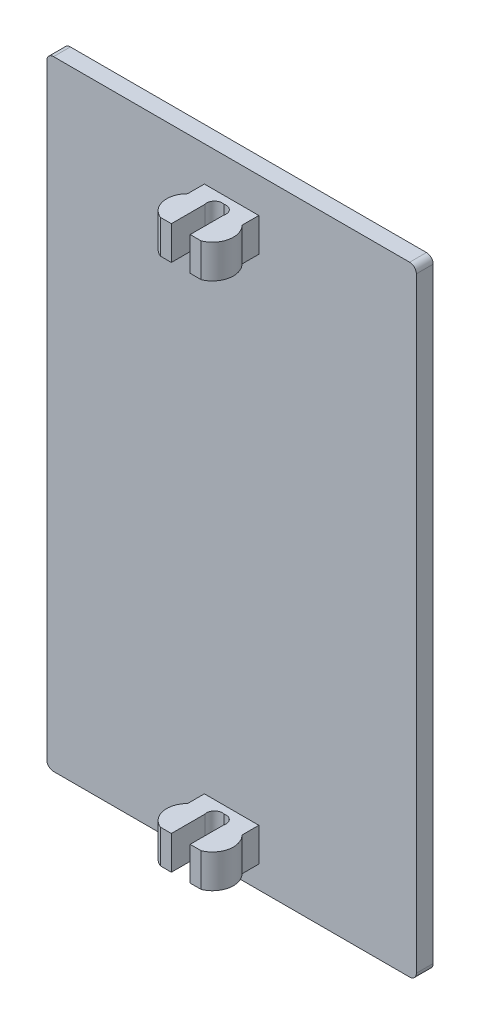
ISO-10303-21;
HEADER;
FILE_DESCRIPTION(('STEP AP214'),'2;1');
FILE_NAME('part.step','',(''),(''),'','','');
FILE_SCHEMA(('AUTOMOTIVE_DESIGN { 1 0 10303 214 1 1 1 1 }'));
ENDSEC;
DATA;
#1=APPLICATION_CONTEXT('core data for automotive mechanical design processes');
#2=APPLICATION_PROTOCOL_DEFINITION('international standard','automotive_design',2000,#1);
#3=PRODUCT_CONTEXT('',#1,'mechanical');
#4=PRODUCT('Part','Part','',(#3));
#5=PRODUCT_RELATED_PRODUCT_CATEGORY('part','',(#4));
#6=PRODUCT_DEFINITION_FORMATION('','',#4);
#7=PRODUCT_DEFINITION_CONTEXT('part definition',#1,'design');
#8=PRODUCT_DEFINITION('design','',#6,#7);
#9=PRODUCT_DEFINITION_SHAPE('','',#8);
#10=(LENGTH_UNIT() NAMED_UNIT(*) SI_UNIT(.MILLI.,.METRE.));
#11=(NAMED_UNIT(*) PLANE_ANGLE_UNIT() SI_UNIT($,.RADIAN.));
#12=(NAMED_UNIT(*) SI_UNIT($,.STERADIAN.) SOLID_ANGLE_UNIT());
#13=UNCERTAINTY_MEASURE_WITH_UNIT(LENGTH_MEASURE(1.E-05),#10,'distance_accuracy_value','');
#14=(GEOMETRIC_REPRESENTATION_CONTEXT(3) GLOBAL_UNCERTAINTY_ASSIGNED_CONTEXT((#13)) GLOBAL_UNIT_ASSIGNED_CONTEXT((#10,
#11,#12)) REPRESENTATION_CONTEXT('',''));
#15=CARTESIAN_POINT('',(0.,0.,0.));
#16=DIRECTION('',(0.,0.,1.));
#17=DIRECTION('',(1.,0.,0.));
#18=AXIS2_PLACEMENT_3D('',#15,#16,#17);
#19=CARTESIAN_POINT('',(-27.5,46.07194529,2.5));
#20=DIRECTION('',(1.,0.,0.));
#21=DIRECTION('',(0.,0.,-1.));
#22=AXIS2_PLACEMENT_3D('',#19,#20,#21);
#23=PLANE('',#22);
#24=DIRECTION('',(0.,-1.,0.));
#25=VECTOR('',#24,1.);
#26=CARTESIAN_POINT('',(-27.5,46.07194529,2.5));
#27=LINE('',#26,#25);
#28=CARTESIAN_POINT('',(-27.5,45.07194529,2.5));
#29=VERTEX_POINT('',#28);
#30=CARTESIAN_POINT('',(-27.5,-45.07194529,2.5));
#31=VERTEX_POINT('',#30);
#32=EDGE_CURVE('E341',#29,#31,#27,.T.);
#33=ORIENTED_EDGE('',*,*,#32,.F.);
#34=DIRECTION('',(0.,0.,-1.));
#35=VECTOR('',#34,1.);
#36=CARTESIAN_POINT('',(-27.5,45.07194529,2.5));
#37=LINE('',#36,#35);
#38=CARTESIAN_POINT('',(-27.5,45.07194529,0.));
#39=VERTEX_POINT('',#38);
#40=EDGE_CURVE('E388',#29,#39,#37,.T.);
#41=ORIENTED_EDGE('',*,*,#40,.T.);
#42=DIRECTION('',(0.,-1.,0.));
#43=VECTOR('',#42,1.);
#44=CARTESIAN_POINT('',(-27.5,46.07194529,0.));
#45=LINE('',#44,#43);
#46=CARTESIAN_POINT('',(-27.5,-45.07194529,0.));
#47=VERTEX_POINT('',#46);
#48=EDGE_CURVE('E340',#39,#47,#45,.T.);
#49=ORIENTED_EDGE('',*,*,#48,.T.);
#50=DIRECTION('',(0.,0.,-1.));
#51=VECTOR('',#50,1.);
#52=CARTESIAN_POINT('',(-27.5,-45.07194529,2.5));
#53=LINE('',#52,#51);
#54=EDGE_CURVE('E386',#47,#31,#53,.F.);
#55=ORIENTED_EDGE('',*,*,#54,.T.);
#56=EDGE_LOOP('',(#33,#41,#49,#55));
#57=FACE_BOUND('',#56,.T.);
#58=ADVANCED_FACE('F33',(#57),#23,.F.);
#59=CARTESIAN_POINT('',(-27.5,-46.07194529,2.5));
#60=DIRECTION('',(0.,1.,0.));
#61=DIRECTION('',(0.,0.,1.));
#62=AXIS2_PLACEMENT_3D('',#59,#60,#61);
#63=PLANE('',#62);
#64=DIRECTION('',(1.,0.,0.));
#65=VECTOR('',#64,1.);
#66=CARTESIAN_POINT('',(-27.5,-46.07194529,0.));
#67=LINE('',#66,#65);
#68=CARTESIAN_POINT('',(-26.5,-46.07194529,0.));
#69=VERTEX_POINT('',#68);
#70=CARTESIAN_POINT('',(26.5,-46.07194529,0.));
#71=VERTEX_POINT('',#70);
#72=EDGE_CURVE('E355',#69,#71,#67,.T.);
#73=ORIENTED_EDGE('',*,*,#72,.T.);
#74=DIRECTION('',(0.,0.,-1.));
#75=VECTOR('',#74,1.);
#76=CARTESIAN_POINT('',(26.5,-46.07194529,2.5));
#77=LINE('',#76,#75);
#78=CARTESIAN_POINT('',(26.5,-46.07194529,2.5));
#79=VERTEX_POINT('',#78);
#80=EDGE_CURVE('E11',#71,#79,#77,.F.);
#81=ORIENTED_EDGE('',*,*,#80,.T.);
#82=DIRECTION('',(1.,0.,0.));
#83=VECTOR('',#82,1.);
#84=CARTESIAN_POINT('',(-27.5,-46.07194529,2.5));
#85=LINE('',#84,#83);
#86=CARTESIAN_POINT('',(-26.5,-46.07194529,2.5));
#87=VERTEX_POINT('',#86);
#88=EDGE_CURVE('E343',#87,#79,#85,.T.);
#89=ORIENTED_EDGE('',*,*,#88,.F.);
#90=DIRECTION('',(0.,0.,-1.));
#91=VECTOR('',#90,1.);
#92=CARTESIAN_POINT('',(-26.5,-46.07194529,2.5));
#93=LINE('',#92,#91);
#94=EDGE_CURVE('E41',#87,#69,#93,.T.);
#95=ORIENTED_EDGE('',*,*,#94,.T.);
#96=EDGE_LOOP('',(#73,#81,#89,#95));
#97=FACE_BOUND('',#96,.T.);
#98=ADVANCED_FACE('F393',(#97),#63,.F.);
#99=CARTESIAN_POINT('',(27.5,46.07194529,2.5));
#100=DIRECTION('',(-1.,0.,0.));
#101=DIRECTION('',(0.,-1.,0.));
#102=AXIS2_PLACEMENT_3D('',#99,#100,#101);
#103=PLANE('',#102);
#104=DIRECTION('',(0.,1.,0.));
#105=VECTOR('',#104,1.);
#106=CARTESIAN_POINT('',(27.5,46.07194529,0.));
#107=LINE('',#106,#105);
#108=CARTESIAN_POINT('',(27.5,-45.07194529,0.));
#109=VERTEX_POINT('',#108);
#110=CARTESIAN_POINT('',(27.5,45.07194529,0.));
#111=VERTEX_POINT('',#110);
#112=EDGE_CURVE('E357',#109,#111,#107,.T.);
#113=ORIENTED_EDGE('',*,*,#112,.T.);
#114=DIRECTION('',(0.,0.,-1.));
#115=VECTOR('',#114,1.);
#116=CARTESIAN_POINT('',(27.5,45.07194529,2.5));
#117=LINE('',#116,#115);
#118=CARTESIAN_POINT('',(27.5,45.07194529,2.5));
#119=VERTEX_POINT('',#118);
#120=EDGE_CURVE('E377',#111,#119,#117,.F.);
#121=ORIENTED_EDGE('',*,*,#120,.T.);
#122=DIRECTION('',(0.,1.,0.));
#123=VECTOR('',#122,1.);
#124=CARTESIAN_POINT('',(27.5,46.07194529,2.5));
#125=LINE('',#124,#123);
#126=CARTESIAN_POINT('',(27.5,-45.07194529,2.5));
#127=VERTEX_POINT('',#126);
#128=EDGE_CURVE('E346',#127,#119,#125,.T.);
#129=ORIENTED_EDGE('',*,*,#128,.F.);
#130=DIRECTION('',(0.,0.,-1.));
#131=VECTOR('',#130,1.);
#132=CARTESIAN_POINT('',(27.5,-45.07194529,2.5));
#133=LINE('',#132,#131);
#134=EDGE_CURVE('E374',#127,#109,#133,.T.);
#135=ORIENTED_EDGE('',*,*,#134,.T.);
#136=EDGE_LOOP('',(#113,#121,#129,#135));
#137=FACE_BOUND('',#136,.T.);
#138=ADVANCED_FACE('F406',(#137),#103,.F.);
#139=CARTESIAN_POINT('',(-27.5,46.07194529,2.5));
#140=DIRECTION('',(0.,-1.,0.));
#141=DIRECTION('',(0.,0.,-1.));
#142=AXIS2_PLACEMENT_3D('',#139,#140,#141);
#143=PLANE('',#142);
#144=DIRECTION('',(-1.,0.,0.));
#145=VECTOR('',#144,1.);
#146=CARTESIAN_POINT('',(-27.5,46.07194529,2.5));
#147=LINE('',#146,#145);
#148=CARTESIAN_POINT('',(26.5,46.07194529,2.5));
#149=VERTEX_POINT('',#148);
#150=CARTESIAN_POINT('',(-26.5,46.07194529,2.5));
#151=VERTEX_POINT('',#150);
#152=EDGE_CURVE('E349',#149,#151,#147,.T.);
#153=ORIENTED_EDGE('',*,*,#152,.F.);
#154=DIRECTION('',(0.,0.,-1.));
#155=VECTOR('',#154,1.);
#156=CARTESIAN_POINT('',(26.5,46.07194529,2.5));
#157=LINE('',#156,#155);
#158=CARTESIAN_POINT('',(26.5,46.07194529,0.));
#159=VERTEX_POINT('',#158);
#160=EDGE_CURVE('E363',#149,#159,#157,.T.);
#161=ORIENTED_EDGE('',*,*,#160,.T.);
#162=DIRECTION('',(-1.,0.,0.));
#163=VECTOR('',#162,1.);
#164=CARTESIAN_POINT('',(-27.5,46.07194529,0.));
#165=LINE('',#164,#163);
#166=CARTESIAN_POINT('',(-26.5,46.07194529,0.));
#167=VERTEX_POINT('',#166);
#168=EDGE_CURVE('E344',#159,#167,#165,.T.);
#169=ORIENTED_EDGE('',*,*,#168,.T.);
#170=DIRECTION('',(0.,0.,-1.));
#171=VECTOR('',#170,1.);
#172=CARTESIAN_POINT('',(-26.5,46.07194529,2.5));
#173=LINE('',#172,#171);
#174=EDGE_CURVE('E352',#167,#151,#173,.F.);
#175=ORIENTED_EDGE('',*,*,#174,.T.);
#176=EDGE_LOOP('',(#153,#161,#169,#175));
#177=FACE_BOUND('',#176,.T.);
#178=ADVANCED_FACE('F415',(#177),#143,.F.);
#179=CARTESIAN_POINT('',(0.,0.,2.5));
#180=DIRECTION('',(0.,0.,1.));
#181=DIRECTION('',(1.,0.,0.));
#182=AXIS2_PLACEMENT_3D('',#179,#180,#181);
#183=PLANE('',#182);
#184=DIRECTION('',(1.,0.,0.));
#185=VECTOR('',#184,1.);
#186=CARTESIAN_POINT('',(4.0530338572275,-42.72805471,2.5));
#187=LINE('',#186,#185);
#188=CARTESIAN_POINT('',(-4.0530338572275,-42.72805471,2.5));
#189=VERTEX_POINT('',#188);
#190=CARTESIAN_POINT('',(4.0530338572275,-42.72805471,2.5));
#191=VERTEX_POINT('',#190);
#192=EDGE_CURVE('E741',#189,#191,#187,.T.);
#193=ORIENTED_EDGE('',*,*,#192,.F.);
#194=DIRECTION('',(0.,1.,0.));
#195=VECTOR('',#194,1.);
#196=CARTESIAN_POINT('',(-4.0530338572275,-42.72805471,2.5));
#197=LINE('',#196,#195);
#198=CARTESIAN_POINT('',(-4.0530338572275,-37.72805471,2.5));
#199=VERTEX_POINT('',#198);
#200=EDGE_CURVE('E774',#189,#199,#197,.T.);
#201=ORIENTED_EDGE('',*,*,#200,.T.);
#202=DIRECTION('',(1.,0.,0.));
#203=VECTOR('',#202,1.);
#204=CARTESIAN_POINT('',(4.0530338572275,-37.72805471,2.5));
#205=LINE('',#204,#203);
#206=CARTESIAN_POINT('',(4.0530338572275,-37.72805471,2.5));
#207=VERTEX_POINT('',#206);
#208=EDGE_CURVE('E803',#199,#207,#205,.T.);
#209=ORIENTED_EDGE('',*,*,#208,.T.);
#210=DIRECTION('',(0.,1.,0.));
#211=VECTOR('',#210,1.);
#212=CARTESIAN_POINT('',(4.0530338572275,-42.72805471,2.5));
#213=LINE('',#212,#211);
#214=EDGE_CURVE('E776',#191,#207,#213,.T.);
#215=ORIENTED_EDGE('',*,*,#214,.F.);
#216=EDGE_LOOP('',(#193,#201,#209,#215));
#217=FACE_BOUND('',#216,.T.);
#218=DIRECTION('',(-1.,0.,0.));
#219=VECTOR('',#218,1.);
#220=CARTESIAN_POINT('',(-4.0530338572275,40.87194529,2.50000000000001));
#221=LINE('',#220,#219);
#222=CARTESIAN_POINT('',(4.0530338572275,40.87194529,2.5));
#223=VERTEX_POINT('',#222);
#224=CARTESIAN_POINT('',(-4.0530338572275,40.87194529,2.50000000000001));
#225=VERTEX_POINT('',#224);
#226=EDGE_CURVE('E276',#223,#225,#221,.T.);
#227=ORIENTED_EDGE('',*,*,#226,.F.);
#228=DIRECTION('',(0.,-1.,0.));
#229=VECTOR('',#228,1.);
#230=CARTESIAN_POINT('',(4.0530338572275,40.87194529,2.5));
#231=LINE('',#230,#229);
#232=CARTESIAN_POINT('',(4.0530338572275,35.87194529,2.5));
#233=VERTEX_POINT('',#232);
#234=EDGE_CURVE('E325',#223,#233,#231,.T.);
#235=ORIENTED_EDGE('',*,*,#234,.T.);
#236=DIRECTION('',(-1.,0.,0.));
#237=VECTOR('',#236,1.);
#238=CARTESIAN_POINT('',(-4.0530338572275,35.87194529,2.50000000000001));
#239=LINE('',#238,#237);
#240=CARTESIAN_POINT('',(-4.0530338572275,35.87194529,2.5));
#241=VERTEX_POINT('',#240);
#242=EDGE_CURVE('E296',#233,#241,#239,.T.);
#243=ORIENTED_EDGE('',*,*,#242,.T.);
#244=DIRECTION('',(0.,-1.,0.));
#245=VECTOR('',#244,1.);
#246=CARTESIAN_POINT('',(-4.0530338572275,40.87194529,2.50000000000001));
#247=LINE('',#246,#245);
#248=EDGE_CURVE('E322',#225,#241,#247,.T.);
#249=ORIENTED_EDGE('',*,*,#248,.F.);
#250=EDGE_LOOP('',(#227,#235,#243,#249));
#251=FACE_BOUND('',#250,.T.);
#252=ORIENTED_EDGE('',*,*,#128,.T.);
#253=CARTESIAN_POINT('',(26.5,45.07194529,2.5));
#254=DIRECTION('',(0.,0.,1.));
#255=DIRECTION('',(1.,0.,0.));
#256=AXIS2_PLACEMENT_3D('',#253,#254,#255);
#257=CIRCLE('',#256,1.);
#258=EDGE_CURVE('E384',#119,#149,#257,.T.);
#259=ORIENTED_EDGE('',*,*,#258,.T.);
#260=ORIENTED_EDGE('',*,*,#152,.T.);
#261=CARTESIAN_POINT('',(-26.5,45.07194529,2.5));
#262=DIRECTION('',(0.,0.,1.));
#263=DIRECTION('',(1.,0.,0.));
#264=AXIS2_PLACEMENT_3D('',#261,#262,#263);
#265=CIRCLE('',#264,1.);
#266=EDGE_CURVE('E382',#151,#29,#265,.T.);
#267=ORIENTED_EDGE('',*,*,#266,.T.);
#268=ORIENTED_EDGE('',*,*,#32,.T.);
#269=CARTESIAN_POINT('',(-26.5,-45.07194529,2.5));
#270=DIRECTION('',(0.,0.,1.));
#271=DIRECTION('',(1.,0.,0.));
#272=AXIS2_PLACEMENT_3D('',#269,#270,#271);
#273=CIRCLE('',#272,1.);
#274=EDGE_CURVE('E53',#31,#87,#273,.T.);
#275=ORIENTED_EDGE('',*,*,#274,.T.);
#276=ORIENTED_EDGE('',*,*,#88,.T.);
#277=CARTESIAN_POINT('',(26.5,-45.07194529,2.5));
#278=DIRECTION('',(0.,0.,1.));
#279=DIRECTION('',(1.,0.,0.));
#280=AXIS2_PLACEMENT_3D('',#277,#278,#279);
#281=CIRCLE('',#280,1.);
#282=EDGE_CURVE('E380',#79,#127,#281,.T.);
#283=ORIENTED_EDGE('',*,*,#282,.T.);
#284=EDGE_LOOP('',(#252,#259,#260,#267,#268,#275,#276,#283));
#285=FACE_BOUND('',#284,.T.);
#286=ADVANCED_FACE('F409',(#217,#251,#285),#183,.T.);
#287=CARTESIAN_POINT('',(0.,0.,0.));
#288=DIRECTION('',(0.,0.,1.));
#289=DIRECTION('',(1.,0.,0.));
#290=AXIS2_PLACEMENT_3D('',#287,#288,#289);
#291=PLANE('',#290);
#292=ORIENTED_EDGE('',*,*,#168,.F.);
#293=CARTESIAN_POINT('',(26.5,45.07194529,0.));
#294=DIRECTION('',(0.,0.,1.));
#295=DIRECTION('',(1.,0.,0.));
#296=AXIS2_PLACEMENT_3D('',#293,#294,#295);
#297=CIRCLE('',#296,1.);
#298=EDGE_CURVE('E372',#159,#111,#297,.F.);
#299=ORIENTED_EDGE('',*,*,#298,.T.);
#300=ORIENTED_EDGE('',*,*,#112,.F.);
#301=CARTESIAN_POINT('',(26.5,-45.07194529,0.));
#302=DIRECTION('',(0.,0.,1.));
#303=DIRECTION('',(1.,0.,0.));
#304=AXIS2_PLACEMENT_3D('',#301,#302,#303);
#305=CIRCLE('',#304,1.);
#306=EDGE_CURVE('E368',#109,#71,#305,.F.);
#307=ORIENTED_EDGE('',*,*,#306,.T.);
#308=ORIENTED_EDGE('',*,*,#72,.F.);
#309=CARTESIAN_POINT('',(-26.5,-45.07194529,0.));
#310=DIRECTION('',(0.,0.,1.));
#311=DIRECTION('',(1.,0.,0.));
#312=AXIS2_PLACEMENT_3D('',#309,#310,#311);
#313=CIRCLE('',#312,1.);
#314=EDGE_CURVE('E366',#69,#47,#313,.F.);
#315=ORIENTED_EDGE('',*,*,#314,.T.);
#316=ORIENTED_EDGE('',*,*,#48,.F.);
#317=CARTESIAN_POINT('',(-26.5,45.07194529,0.));
#318=DIRECTION('',(0.,0.,1.));
#319=DIRECTION('',(1.,0.,0.));
#320=AXIS2_PLACEMENT_3D('',#317,#318,#319);
#321=CIRCLE('',#320,1.);
#322=EDGE_CURVE('E370',#39,#167,#321,.F.);
#323=ORIENTED_EDGE('',*,*,#322,.T.);
#324=EDGE_LOOP('',(#292,#299,#300,#307,#308,#315,#316,#323));
#325=FACE_BOUND('',#324,.T.);
#326=ADVANCED_FACE('F397',(#325),#291,.F.);
#327=CARTESIAN_POINT('',(0.289020958101441,40.87194529,4.75858231023207));
#328=DIRECTION('',(0.,-1.,0.));
#329=DIRECTION('',(0.,0.,-1.));
#330=AXIS2_PLACEMENT_3D('',#327,#328,#329);
#331=CYLINDRICAL_SURFACE('',#330,1.15295111849489);
#332=CARTESIAN_POINT('',(0.289020958101441,35.87194529,4.75858231023207));
#333=DIRECTION('',(0.,-1.,0.));
#334=DIRECTION('',(0.,0.,1.));
#335=AXIS2_PLACEMENT_3D('',#332,#333,#334);
#336=CIRCLE('',#335,1.15295111849489);
#337=CARTESIAN_POINT('',(0.,35.87194529,3.64244469890596));
#338=VERTEX_POINT('',#337);
#339=CARTESIAN_POINT('',(1.4,35.87194529,5.06683845388661));
#340=VERTEX_POINT('',#339);
#341=EDGE_CURVE('E255',#338,#340,#336,.T.);
#342=ORIENTED_EDGE('',*,*,#341,.T.);
#343=DIRECTION('',(0.,-1.,0.));
#344=VECTOR('',#343,1.);
#345=CARTESIAN_POINT('',(1.4,40.87194529,5.06683845388661));
#346=LINE('',#345,#344);
#347=CARTESIAN_POINT('',(1.4,40.87194529,5.06683845388661));
#348=VERTEX_POINT('',#347);
#349=EDGE_CURVE('E337',#348,#340,#346,.T.);
#350=ORIENTED_EDGE('',*,*,#349,.F.);
#351=CARTESIAN_POINT('',(0.289020958101441,40.87194529,4.75858231023207));
#352=DIRECTION('',(0.,-1.,0.));
#353=DIRECTION('',(0.,0.,1.));
#354=AXIS2_PLACEMENT_3D('',#351,#352,#353);
#355=CIRCLE('',#354,1.15295111849489);
#356=CARTESIAN_POINT('',(0.,40.87194529,3.64244469890596));
#357=VERTEX_POINT('',#356);
#358=EDGE_CURVE('E264',#357,#348,#355,.T.);
#359=ORIENTED_EDGE('',*,*,#358,.F.);
#360=DIRECTION('',(0.,-1.,0.));
#361=VECTOR('',#360,1.);
#362=CARTESIAN_POINT('',(0.,40.87194529,3.64244469890596));
#363=LINE('',#362,#361);
#364=EDGE_CURVE('E287',#357,#338,#363,.T.);
#365=ORIENTED_EDGE('',*,*,#364,.T.);
#366=EDGE_LOOP('',(#342,#350,#359,#365));
#367=FACE_BOUND('',#366,.T.);
#368=ADVANCED_FACE('F661',(#367),#331,.F.);
#369=CARTESIAN_POINT('',(1.4,40.87194529,10.0668384538866));
#370=DIRECTION('',(1.,0.,0.));
#371=DIRECTION('',(0.,0.,-1.));
#372=AXIS2_PLACEMENT_3D('',#369,#370,#371);
#373=PLANE('',#372);
#374=DIRECTION('',(0.,0.,1.));
#375=VECTOR('',#374,1.);
#376=CARTESIAN_POINT('',(1.4,35.87194529,10.0668384538866));
#377=LINE('',#376,#375);
#378=CARTESIAN_POINT('',(1.4,35.87194529,10.0668384538866));
#379=VERTEX_POINT('',#378);
#380=EDGE_CURVE('E258',#340,#379,#377,.T.);
#381=ORIENTED_EDGE('',*,*,#380,.T.);
#382=DIRECTION('',(0.,-1.,0.));
#383=VECTOR('',#382,1.);
#384=CARTESIAN_POINT('',(1.4,40.87194529,10.0668384538866));
#385=LINE('',#384,#383);
#386=CARTESIAN_POINT('',(1.4,40.87194529,10.0668384538866));
#387=VERTEX_POINT('',#386);
#388=EDGE_CURVE('E334',#387,#379,#385,.T.);
#389=ORIENTED_EDGE('',*,*,#388,.F.);
#390=DIRECTION('',(0.,0.,1.));
#391=VECTOR('',#390,1.);
#392=CARTESIAN_POINT('',(1.4,40.87194529,10.0668384538866));
#393=LINE('',#392,#391);
#394=EDGE_CURVE('E267',#348,#387,#393,.T.);
#395=ORIENTED_EDGE('',*,*,#394,.F.);
#396=ORIENTED_EDGE('',*,*,#349,.T.);
#397=EDGE_LOOP('',(#381,#389,#395,#396));
#398=FACE_BOUND('',#397,.T.);
#399=ADVANCED_FACE('F652',(#398),#373,.F.);
#400=CARTESIAN_POINT('',(3.03612301673039,40.87194529,10.0668384538866));
#401=DIRECTION('',(0.,0.,-1.));
#402=DIRECTION('',(-1.,0.,0.));
#403=AXIS2_PLACEMENT_3D('',#400,#401,#402);
#404=PLANE('',#403);
#405=DIRECTION('',(1.,0.,0.));
#406=VECTOR('',#405,1.);
#407=CARTESIAN_POINT('',(3.03612301673039,35.87194529,10.0668384538866));
#408=LINE('',#407,#406);
#409=CARTESIAN_POINT('',(3.03612301673039,35.87194529,10.0668384538866));
#410=VERTEX_POINT('',#409);
#411=EDGE_CURVE('E290',#379,#410,#408,.T.);
#412=ORIENTED_EDGE('',*,*,#411,.T.);
#413=DIRECTION('',(0.,-1.,0.));
#414=VECTOR('',#413,1.);
#415=CARTESIAN_POINT('',(3.03612301673039,40.87194529,10.0668384538866));
#416=LINE('',#415,#414);
#417=CARTESIAN_POINT('',(3.03612301673039,40.87194529,10.0668384538866));
#418=VERTEX_POINT('',#417);
#419=EDGE_CURVE('E331',#418,#410,#416,.T.);
#420=ORIENTED_EDGE('',*,*,#419,.F.);
#421=DIRECTION('',(1.,0.,0.));
#422=VECTOR('',#421,1.);
#423=CARTESIAN_POINT('',(3.03612301673039,40.87194529,10.0668384538866));
#424=LINE('',#423,#422);
#425=EDGE_CURVE('E270',#387,#418,#424,.T.);
#426=ORIENTED_EDGE('',*,*,#425,.F.);
#427=ORIENTED_EDGE('',*,*,#388,.T.);
#428=EDGE_LOOP('',(#412,#420,#426,#427));
#429=FACE_BOUND('',#428,.T.);
#430=ADVANCED_FACE('F643',(#429),#404,.F.);
#431=CARTESIAN_POINT('',(1.85369879275646,40.87194529,7.19406089613511));
#432=DIRECTION('',(0.,-1.,0.));
#433=DIRECTION('',(0.,0.,-1.));
#434=AXIS2_PLACEMENT_3D('',#431,#432,#433);
#435=CYLINDRICAL_SURFACE('',#434,3.10660231470992);
#436=CARTESIAN_POINT('',(1.85369879275646,35.87194529,7.19406089613511));
#437=DIRECTION('',(0.,1.,0.));
#438=DIRECTION('',(0.,0.,1.));
#439=AXIS2_PLACEMENT_3D('',#436,#437,#438);
#440=CIRCLE('',#439,3.10660231470992);
#441=CARTESIAN_POINT('',(4.0530338572275,35.87194529,5.));
#442=VERTEX_POINT('',#441);
#443=EDGE_CURVE('E292',#410,#442,#440,.T.);
#444=ORIENTED_EDGE('',*,*,#443,.T.);
#445=DIRECTION('',(0.,-1.,0.));
#446=VECTOR('',#445,1.);
#447=CARTESIAN_POINT('',(4.0530338572275,40.87194529,5.));
#448=LINE('',#447,#446);
#449=CARTESIAN_POINT('',(4.0530338572275,40.87194529,5.));
#450=VERTEX_POINT('',#449);
#451=EDGE_CURVE('E328',#450,#442,#448,.T.);
#452=ORIENTED_EDGE('',*,*,#451,.F.);
#453=CARTESIAN_POINT('',(1.85369879275646,40.87194529,7.19406089613511));
#454=DIRECTION('',(0.,1.,0.));
#455=DIRECTION('',(0.,0.,1.));
#456=AXIS2_PLACEMENT_3D('',#453,#454,#455);
#457=CIRCLE('',#456,3.10660231470992);
#458=EDGE_CURVE('E272',#418,#450,#457,.T.);
#459=ORIENTED_EDGE('',*,*,#458,.F.);
#460=ORIENTED_EDGE('',*,*,#419,.T.);
#461=EDGE_LOOP('',(#444,#452,#459,#460));
#462=FACE_BOUND('',#461,.T.);
#463=ADVANCED_FACE('F634',(#462),#435,.T.);
#464=CARTESIAN_POINT('',(4.0530338572275,40.87194529,5.));
#465=DIRECTION('',(-1.,0.,0.));
#466=DIRECTION('',(0.,0.,1.));
#467=AXIS2_PLACEMENT_3D('',#464,#465,#466);
#468=PLANE('',#467);
#469=DIRECTION('',(0.,0.,-1.));
#470=VECTOR('',#469,1.);
#471=CARTESIAN_POINT('',(4.0530338572275,35.87194529,5.));
#472=LINE('',#471,#470);
#473=EDGE_CURVE('E294',#442,#233,#472,.T.);
#474=ORIENTED_EDGE('',*,*,#473,.T.);
#475=ORIENTED_EDGE('',*,*,#234,.F.);
#476=DIRECTION('',(0.,0.,-1.));
#477=VECTOR('',#476,1.);
#478=CARTESIAN_POINT('',(4.0530338572275,40.87194529,5.));
#479=LINE('',#478,#477);
#480=EDGE_CURVE('E274',#450,#223,#479,.T.);
#481=ORIENTED_EDGE('',*,*,#480,.F.);
#482=ORIENTED_EDGE('',*,*,#451,.T.);
#483=EDGE_LOOP('',(#474,#475,#481,#482));
#484=FACE_BOUND('',#483,.T.);
#485=ADVANCED_FACE('F625',(#484),#468,.F.);
#486=CARTESIAN_POINT('',(-4.0530338572275,40.87194529,5.00000000000001));
#487=DIRECTION('',(1.,0.,0.));
#488=DIRECTION('',(0.,0.,-1.));
#489=AXIS2_PLACEMENT_3D('',#486,#487,#488);
#490=PLANE('',#489);
#491=DIRECTION('',(0.,0.,1.));
#492=VECTOR('',#491,1.);
#493=CARTESIAN_POINT('',(-4.0530338572275,35.87194529,5.00000000000001));
#494=LINE('',#493,#492);
#495=CARTESIAN_POINT('',(-4.0530338572275,35.87194529,5.));
#496=VERTEX_POINT('',#495);
#497=EDGE_CURVE('E299',#241,#496,#494,.T.);
#498=ORIENTED_EDGE('',*,*,#497,.T.);
#499=DIRECTION('',(0.,-1.,0.));
#500=VECTOR('',#499,1.);
#501=CARTESIAN_POINT('',(-4.0530338572275,40.87194529,5.));
#502=LINE('',#501,#500);
#503=CARTESIAN_POINT('',(-4.0530338572275,40.87194529,5.));
#504=VERTEX_POINT('',#503);
#505=EDGE_CURVE('E319',#504,#496,#502,.T.);
#506=ORIENTED_EDGE('',*,*,#505,.F.);
#507=DIRECTION('',(0.,0.,1.));
#508=VECTOR('',#507,1.);
#509=CARTESIAN_POINT('',(-4.0530338572275,40.87194529,5.00000000000001));
#510=LINE('',#509,#508);
#511=EDGE_CURVE('E278',#225,#504,#510,.T.);
#512=ORIENTED_EDGE('',*,*,#511,.F.);
#513=ORIENTED_EDGE('',*,*,#248,.T.);
#514=EDGE_LOOP('',(#498,#506,#512,#513));
#515=FACE_BOUND('',#514,.T.);
#516=ADVANCED_FACE('F616',(#515),#490,.F.);
#517=CARTESIAN_POINT('',(-1.85369879275646,40.87194529,7.19406089613511));
#518=DIRECTION('',(0.,-1.,0.));
#519=DIRECTION('',(0.,0.,-1.));
#520=AXIS2_PLACEMENT_3D('',#517,#518,#519);
#521=CYLINDRICAL_SURFACE('',#520,3.10660231470992);
#522=CARTESIAN_POINT('',(-1.85369879275646,35.87194529,7.19406089613511));
#523=DIRECTION('',(0.,1.,0.));
#524=DIRECTION('',(0.,0.,-1.));
#525=AXIS2_PLACEMENT_3D('',#522,#523,#524);
#526=CIRCLE('',#525,3.10660231470992);
#527=CARTESIAN_POINT('',(-3.03612301673039,35.87194529,10.0668384538866));
#528=VERTEX_POINT('',#527);
#529=EDGE_CURVE('E301',#496,#528,#526,.T.);
#530=ORIENTED_EDGE('',*,*,#529,.T.);
#531=DIRECTION('',(0.,-1.,0.));
#532=VECTOR('',#531,1.);
#533=CARTESIAN_POINT('',(-3.03612301673039,40.87194529,10.0668384538866));
#534=LINE('',#533,#532);
#535=CARTESIAN_POINT('',(-3.03612301673039,40.87194529,10.0668384538866));
#536=VERTEX_POINT('',#535);
#537=EDGE_CURVE('E316',#536,#528,#534,.T.);
#538=ORIENTED_EDGE('',*,*,#537,.F.);
#539=CARTESIAN_POINT('',(-1.85369879275646,40.87194529,7.19406089613511));
#540=DIRECTION('',(0.,1.,0.));
#541=DIRECTION('',(0.,0.,-1.));
#542=AXIS2_PLACEMENT_3D('',#539,#540,#541);
#543=CIRCLE('',#542,3.10660231470992);
#544=EDGE_CURVE('E280',#504,#536,#543,.T.);
#545=ORIENTED_EDGE('',*,*,#544,.F.);
#546=ORIENTED_EDGE('',*,*,#505,.T.);
#547=EDGE_LOOP('',(#530,#538,#545,#546));
#548=FACE_BOUND('',#547,.T.);
#549=ADVANCED_FACE('F607',(#548),#521,.T.);
#550=CARTESIAN_POINT('',(-3.03612301673039,40.87194529,10.0668384538866));
#551=DIRECTION('',(0.,0.,-1.));
#552=DIRECTION('',(-1.,0.,0.));
#553=AXIS2_PLACEMENT_3D('',#550,#551,#552);
#554=PLANE('',#553);
#555=DIRECTION('',(1.,0.,0.));
#556=VECTOR('',#555,1.);
#557=CARTESIAN_POINT('',(-3.03612301673039,35.87194529,10.0668384538866));
#558=LINE('',#557,#556);
#559=CARTESIAN_POINT('',(-1.4,35.87194529,10.0668384538866));
#560=VERTEX_POINT('',#559);
#561=EDGE_CURVE('E303',#528,#560,#558,.T.);
#562=ORIENTED_EDGE('',*,*,#561,.T.);
#563=DIRECTION('',(0.,-1.,0.));
#564=VECTOR('',#563,1.);
#565=CARTESIAN_POINT('',(-1.4,40.87194529,10.0668384538866));
#566=LINE('',#565,#564);
#567=CARTESIAN_POINT('',(-1.4,40.87194529,10.0668384538866));
#568=VERTEX_POINT('',#567);
#569=EDGE_CURVE('E313',#568,#560,#566,.T.);
#570=ORIENTED_EDGE('',*,*,#569,.F.);
#571=DIRECTION('',(1.,0.,0.));
#572=VECTOR('',#571,1.);
#573=CARTESIAN_POINT('',(-3.03612301673039,40.87194529,10.0668384538866));
#574=LINE('',#573,#572);
#575=EDGE_CURVE('E282',#536,#568,#574,.T.);
#576=ORIENTED_EDGE('',*,*,#575,.F.);
#577=ORIENTED_EDGE('',*,*,#537,.T.);
#578=EDGE_LOOP('',(#562,#570,#576,#577));
#579=FACE_BOUND('',#578,.T.);
#580=ADVANCED_FACE('F598',(#579),#554,.F.);
#581=CARTESIAN_POINT('',(-1.4,40.87194529,10.0668384538866));
#582=DIRECTION('',(-1.,0.,0.));
#583=DIRECTION('',(0.,0.,1.));
#584=AXIS2_PLACEMENT_3D('',#581,#582,#583);
#585=PLANE('',#584);
#586=DIRECTION('',(0.,0.,-1.));
#587=VECTOR('',#586,1.);
#588=CARTESIAN_POINT('',(-1.4,35.87194529,10.0668384538866));
#589=LINE('',#588,#587);
#590=CARTESIAN_POINT('',(-1.4,35.87194529,5.06683845388661));
#591=VERTEX_POINT('',#590);
#592=EDGE_CURVE('E305',#560,#591,#589,.T.);
#593=ORIENTED_EDGE('',*,*,#592,.T.);
#594=DIRECTION('',(0.,-1.,0.));
#595=VECTOR('',#594,1.);
#596=CARTESIAN_POINT('',(-1.4,40.87194529,5.06683845388661));
#597=LINE('',#596,#595);
#598=CARTESIAN_POINT('',(-1.4,40.87194529,5.06683845388661));
#599=VERTEX_POINT('',#598);
#600=EDGE_CURVE('E310',#599,#591,#597,.T.);
#601=ORIENTED_EDGE('',*,*,#600,.F.);
#602=DIRECTION('',(0.,0.,-1.));
#603=VECTOR('',#602,1.);
#604=CARTESIAN_POINT('',(-1.4,40.87194529,10.0668384538866));
#605=LINE('',#604,#603);
#606=EDGE_CURVE('E284',#568,#599,#605,.T.);
#607=ORIENTED_EDGE('',*,*,#606,.F.);
#608=ORIENTED_EDGE('',*,*,#569,.T.);
#609=EDGE_LOOP('',(#593,#601,#607,#608));
#610=FACE_BOUND('',#609,.T.);
#611=ADVANCED_FACE('F589',(#610),#585,.F.);
#612=CARTESIAN_POINT('',(-0.28902095810144,40.87194529,4.75858231023207));
#613=DIRECTION('',(0.,-1.,0.));
#614=DIRECTION('',(0.,0.,-1.));
#615=AXIS2_PLACEMENT_3D('',#612,#613,#614);
#616=CYLINDRICAL_SURFACE('',#615,1.15295111849489);
#617=CARTESIAN_POINT('',(-0.28902095810144,35.87194529,4.75858231023207));
#618=DIRECTION('',(0.,-1.,0.));
#619=DIRECTION('',(0.,0.,-1.));
#620=AXIS2_PLACEMENT_3D('',#617,#618,#619);
#621=CIRCLE('',#620,1.15295111849489);
#622=EDGE_CURVE('E268',#591,#338,#621,.T.);
#623=ORIENTED_EDGE('',*,*,#622,.T.);
#624=ORIENTED_EDGE('',*,*,#364,.F.);
#625=CARTESIAN_POINT('',(-0.28902095810144,40.87194529,4.75858231023207));
#626=DIRECTION('',(0.,-1.,0.));
#627=DIRECTION('',(0.,0.,-1.));
#628=AXIS2_PLACEMENT_3D('',#625,#626,#627);
#629=CIRCLE('',#628,1.15295111849489);
#630=EDGE_CURVE('E286',#599,#357,#629,.T.);
#631=ORIENTED_EDGE('',*,*,#630,.F.);
#632=ORIENTED_EDGE('',*,*,#600,.T.);
#633=EDGE_LOOP('',(#623,#624,#631,#632));
#634=FACE_BOUND('',#633,.T.);
#635=ADVANCED_FACE('F580',(#634),#616,.F.);
#636=CARTESIAN_POINT('',(0.289020958101441,40.87194529,4.75858231023207));
#637=DIRECTION('',(0.,1.,0.));
#638=DIRECTION('',(0.,0.,1.));
#639=AXIS2_PLACEMENT_3D('',#636,#637,#638);
#640=PLANE('',#639);
#641=ORIENTED_EDGE('',*,*,#358,.T.);
#642=ORIENTED_EDGE('',*,*,#394,.T.);
#643=ORIENTED_EDGE('',*,*,#425,.T.);
#644=ORIENTED_EDGE('',*,*,#458,.T.);
#645=ORIENTED_EDGE('',*,*,#480,.T.);
#646=ORIENTED_EDGE('',*,*,#226,.T.);
#647=ORIENTED_EDGE('',*,*,#511,.T.);
#648=ORIENTED_EDGE('',*,*,#544,.T.);
#649=ORIENTED_EDGE('',*,*,#575,.T.);
#650=ORIENTED_EDGE('',*,*,#606,.T.);
#651=ORIENTED_EDGE('',*,*,#630,.T.);
#652=EDGE_LOOP('',(#641,#642,#643,#644,#645,#646,#647,#648,#649,#650,#651));
#653=FACE_BOUND('',#652,.T.);
#654=ADVANCED_FACE('F571',(#653),#640,.T.);
#655=CARTESIAN_POINT('',(0.289020958101441,35.87194529,4.75858231023207));
#656=DIRECTION('',(0.,1.,0.));
#657=DIRECTION('',(0.,0.,1.));
#658=AXIS2_PLACEMENT_3D('',#655,#656,#657);
#659=PLANE('',#658);
#660=ORIENTED_EDGE('',*,*,#341,.F.);
#661=ORIENTED_EDGE('',*,*,#622,.F.);
#662=ORIENTED_EDGE('',*,*,#592,.F.);
#663=ORIENTED_EDGE('',*,*,#561,.F.);
#664=ORIENTED_EDGE('',*,*,#529,.F.);
#665=ORIENTED_EDGE('',*,*,#497,.F.);
#666=ORIENTED_EDGE('',*,*,#242,.F.);
#667=ORIENTED_EDGE('',*,*,#473,.F.);
#668=ORIENTED_EDGE('',*,*,#443,.F.);
#669=ORIENTED_EDGE('',*,*,#411,.F.);
#670=ORIENTED_EDGE('',*,*,#380,.F.);
#671=EDGE_LOOP('',(#660,#661,#662,#663,#664,#665,#666,#667,#668,#669,#670));
#672=FACE_BOUND('',#671,.T.);
#673=ADVANCED_FACE('F563',(#672),#659,.F.);
#674=CARTESIAN_POINT('',(-0.289020958101439,-42.72805471,4.75858231023207));
#675=DIRECTION('',(0.,1.,0.));
#676=DIRECTION('',(0.,0.,1.));
#677=AXIS2_PLACEMENT_3D('',#674,#675,#676);
#678=CYLINDRICAL_SURFACE('',#677,1.15295111849489);
#679=CARTESIAN_POINT('',(-0.289020958101439,-37.72805471,4.75858231023207));
#680=DIRECTION('',(0.,1.,0.));
#681=DIRECTION('',(0.,0.,-1.));
#682=AXIS2_PLACEMENT_3D('',#679,#680,#681);
#683=CIRCLE('',#682,1.15295111849489);
#684=CARTESIAN_POINT('',(0.,-37.72805471,3.64244469890596));
#685=VERTEX_POINT('',#684);
#686=CARTESIAN_POINT('',(-1.4,-37.72805471,5.06683845388661));
#687=VERTEX_POINT('',#686);
#688=EDGE_CURVE('E254',#685,#687,#683,.T.);
#689=ORIENTED_EDGE('',*,*,#688,.T.);
#690=DIRECTION('',(0.,1.,0.));
#691=VECTOR('',#690,1.);
#692=CARTESIAN_POINT('',(-1.4,-42.72805471,5.06683845388661));
#693=LINE('',#692,#691);
#694=CARTESIAN_POINT('',(-1.4,-42.72805471,5.06683845388661));
#695=VERTEX_POINT('',#694);
#696=EDGE_CURVE('E234',#695,#687,#693,.T.);
#697=ORIENTED_EDGE('',*,*,#696,.F.);
#698=CARTESIAN_POINT('',(-0.289020958101439,-42.72805471,4.75858231023207));
#699=DIRECTION('',(0.,1.,0.));
#700=DIRECTION('',(0.,0.,-1.));
#701=AXIS2_PLACEMENT_3D('',#698,#699,#700);
#702=CIRCLE('',#701,1.15295111849489);
#703=CARTESIAN_POINT('',(0.,-42.72805471,3.64244469890596));
#704=VERTEX_POINT('',#703);
#705=EDGE_CURVE('E241',#704,#695,#702,.T.);
#706=ORIENTED_EDGE('',*,*,#705,.F.);
#707=DIRECTION('',(0.,1.,0.));
#708=VECTOR('',#707,1.);
#709=CARTESIAN_POINT('',(0.,-42.72805471,3.64244469890596));
#710=LINE('',#709,#708);
#711=EDGE_CURVE('E793',#704,#685,#710,.T.);
#712=ORIENTED_EDGE('',*,*,#711,.T.);
#713=EDGE_LOOP('',(#689,#697,#706,#712));
#714=FACE_BOUND('',#713,.T.);
#715=ADVANCED_FACE('F252',(#714),#678,.F.);
#716=CARTESIAN_POINT('',(-1.4,-42.72805471,10.0668384538866));
#717=DIRECTION('',(-1.,0.,0.));
#718=DIRECTION('',(0.,0.,1.));
#719=AXIS2_PLACEMENT_3D('',#716,#717,#718);
#720=PLANE('',#719);
#721=DIRECTION('',(0.,0.,1.));
#722=VECTOR('',#721,1.);
#723=CARTESIAN_POINT('',(-1.4,-37.72805471,10.0668384538866));
#724=LINE('',#723,#722);
#725=CARTESIAN_POINT('',(-1.4,-37.72805471,10.0668384538866));
#726=VERTEX_POINT('',#725);
#727=EDGE_CURVE('E795',#687,#726,#724,.T.);
#728=ORIENTED_EDGE('',*,*,#727,.T.);
#729=DIRECTION('',(0.,1.,0.));
#730=VECTOR('',#729,1.);
#731=CARTESIAN_POINT('',(-1.4,-42.72805471,10.0668384538866));
#732=LINE('',#731,#730);
#733=CARTESIAN_POINT('',(-1.4,-42.72805471,10.0668384538866));
#734=VERTEX_POINT('',#733);
#735=EDGE_CURVE('E237',#734,#726,#732,.T.);
#736=ORIENTED_EDGE('',*,*,#735,.F.);
#737=DIRECTION('',(0.,0.,1.));
#738=VECTOR('',#737,1.);
#739=CARTESIAN_POINT('',(-1.4,-42.72805471,10.0668384538866));
#740=LINE('',#739,#738);
#741=EDGE_CURVE('E230',#695,#734,#740,.T.);
#742=ORIENTED_EDGE('',*,*,#741,.F.);
#743=ORIENTED_EDGE('',*,*,#696,.T.);
#744=EDGE_LOOP('',(#728,#736,#742,#743));
#745=FACE_BOUND('',#744,.T.);
#746=ADVANCED_FACE('F232',(#745),#720,.F.);
#747=CARTESIAN_POINT('',(-3.03612301673039,-42.72805471,10.0668384538866));
#748=DIRECTION('',(0.,0.,-1.));
#749=DIRECTION('',(-1.,0.,0.));
#750=AXIS2_PLACEMENT_3D('',#747,#748,#749);
#751=PLANE('',#750);
#752=DIRECTION('',(-1.,0.,0.));
#753=VECTOR('',#752,1.);
#754=CARTESIAN_POINT('',(-3.03612301673039,-37.72805471,10.0668384538866));
#755=LINE('',#754,#753);
#756=CARTESIAN_POINT('',(-3.03612301673039,-37.72805471,10.0668384538866));
#757=VERTEX_POINT('',#756);
#758=EDGE_CURVE('E797',#726,#757,#755,.T.);
#759=ORIENTED_EDGE('',*,*,#758,.T.);
#760=DIRECTION('',(0.,1.,0.));
#761=VECTOR('',#760,1.);
#762=CARTESIAN_POINT('',(-3.03612301673039,-42.72805471,10.0668384538866));
#763=LINE('',#762,#761);
#764=CARTESIAN_POINT('',(-3.03612301673039,-42.72805471,10.0668384538866));
#765=VERTEX_POINT('',#764);
#766=EDGE_CURVE('E260',#765,#757,#763,.T.);
#767=ORIENTED_EDGE('',*,*,#766,.F.);
#768=DIRECTION('',(-1.,0.,0.));
#769=VECTOR('',#768,1.);
#770=CARTESIAN_POINT('',(-3.03612301673039,-42.72805471,10.0668384538866));
#771=LINE('',#770,#769);
#772=EDGE_CURVE('E240',#734,#765,#771,.T.);
#773=ORIENTED_EDGE('',*,*,#772,.F.);
#774=ORIENTED_EDGE('',*,*,#735,.T.);
#775=EDGE_LOOP('',(#759,#767,#773,#774));
#776=FACE_BOUND('',#775,.T.);
#777=ADVANCED_FACE('F539',(#776),#751,.F.);
#778=CARTESIAN_POINT('',(-1.85369879275646,-42.72805471,7.19406089613511));
#779=DIRECTION('',(0.,1.,0.));
#780=DIRECTION('',(0.,0.,1.));
#781=AXIS2_PLACEMENT_3D('',#778,#779,#780);
#782=CYLINDRICAL_SURFACE('',#781,3.10660231470992);
#783=CARTESIAN_POINT('',(-1.85369879275646,-37.72805471,7.19406089613511));
#784=DIRECTION('',(0.,-1.,0.));
#785=DIRECTION('',(0.,0.,-1.));
#786=AXIS2_PLACEMENT_3D('',#783,#784,#785);
#787=CIRCLE('',#786,3.10660231470992);
#788=CARTESIAN_POINT('',(-4.0530338572275,-37.72805471,5.));
#789=VERTEX_POINT('',#788);
#790=EDGE_CURVE('E799',#757,#789,#787,.T.);
#791=ORIENTED_EDGE('',*,*,#790,.T.);
#792=DIRECTION('',(0.,1.,0.));
#793=VECTOR('',#792,1.);
#794=CARTESIAN_POINT('',(-4.0530338572275,-42.72805471,5.));
#795=LINE('',#794,#793);
#796=CARTESIAN_POINT('',(-4.0530338572275,-42.72805471,5.));
#797=VERTEX_POINT('',#796);
#798=EDGE_CURVE('E829',#797,#789,#795,.T.);
#799=ORIENTED_EDGE('',*,*,#798,.F.);
#800=CARTESIAN_POINT('',(-1.85369879275646,-42.72805471,7.19406089613511));
#801=DIRECTION('',(0.,-1.,0.));
#802=DIRECTION('',(0.,0.,-1.));
#803=AXIS2_PLACEMENT_3D('',#800,#801,#802);
#804=CIRCLE('',#803,3.10660231470992);
#805=EDGE_CURVE('E783',#765,#797,#804,.T.);
#806=ORIENTED_EDGE('',*,*,#805,.F.);
#807=ORIENTED_EDGE('',*,*,#766,.T.);
#808=EDGE_LOOP('',(#791,#799,#806,#807));
#809=FACE_BOUND('',#808,.T.);
#810=ADVANCED_FACE('F530',(#809),#782,.T.);
#811=CARTESIAN_POINT('',(-4.0530338572275,-42.72805471,5.));
#812=DIRECTION('',(1.,0.,0.));
#813=DIRECTION('',(0.,0.,-1.));
#814=AXIS2_PLACEMENT_3D('',#811,#812,#813);
#815=PLANE('',#814);
#816=DIRECTION('',(0.,0.,-1.));
#817=VECTOR('',#816,1.);
#818=CARTESIAN_POINT('',(-4.0530338572275,-37.72805471,5.));
#819=LINE('',#818,#817);
#820=EDGE_CURVE('E801',#789,#199,#819,.T.);
#821=ORIENTED_EDGE('',*,*,#820,.T.);
#822=ORIENTED_EDGE('',*,*,#200,.F.);
#823=DIRECTION('',(0.,0.,-1.));
#824=VECTOR('',#823,1.);
#825=CARTESIAN_POINT('',(-4.0530338572275,-42.72805471,5.));
#826=LINE('',#825,#824);
#827=EDGE_CURVE('E779',#797,#189,#826,.T.);
#828=ORIENTED_EDGE('',*,*,#827,.F.);
#829=ORIENTED_EDGE('',*,*,#798,.T.);
#830=EDGE_LOOP('',(#821,#822,#828,#829));
#831=FACE_BOUND('',#830,.T.);
#832=ADVANCED_FACE('F521',(#831),#815,.F.);
#833=CARTESIAN_POINT('',(4.0530338572275,-42.72805471,5.));
#834=DIRECTION('',(-1.,0.,0.));
#835=DIRECTION('',(0.,0.,1.));
#836=AXIS2_PLACEMENT_3D('',#833,#834,#835);
#837=PLANE('',#836);
#838=DIRECTION('',(0.,0.,1.));
#839=VECTOR('',#838,1.);
#840=CARTESIAN_POINT('',(4.0530338572275,-37.72805471,5.));
#841=LINE('',#840,#839);
#842=CARTESIAN_POINT('',(4.0530338572275,-37.72805471,5.));
#843=VERTEX_POINT('',#842);
#844=EDGE_CURVE('E805',#207,#843,#841,.T.);
#845=ORIENTED_EDGE('',*,*,#844,.T.);
#846=DIRECTION('',(0.,1.,0.));
#847=VECTOR('',#846,1.);
#848=CARTESIAN_POINT('',(4.0530338572275,-42.72805471,5.));
#849=LINE('',#848,#847);
#850=CARTESIAN_POINT('',(4.0530338572275,-42.72805471,5.));
#851=VERTEX_POINT('',#850);
#852=EDGE_CURVE('E824',#851,#843,#849,.T.);
#853=ORIENTED_EDGE('',*,*,#852,.F.);
#854=DIRECTION('',(0.,0.,1.));
#855=VECTOR('',#854,1.);
#856=CARTESIAN_POINT('',(4.0530338572275,-42.72805471,5.));
#857=LINE('',#856,#855);
#858=EDGE_CURVE('E778',#191,#851,#857,.T.);
#859=ORIENTED_EDGE('',*,*,#858,.F.);
#860=ORIENTED_EDGE('',*,*,#214,.T.);
#861=EDGE_LOOP('',(#845,#853,#859,#860));
#862=FACE_BOUND('',#861,.T.);
#863=ADVANCED_FACE('F512',(#862),#837,.F.);
#864=CARTESIAN_POINT('',(1.85369879275645,-42.72805471,7.19406089613511));
#865=DIRECTION('',(0.,1.,0.));
#866=DIRECTION('',(0.,0.,1.));
#867=AXIS2_PLACEMENT_3D('',#864,#865,#866);
#868=CYLINDRICAL_SURFACE('',#867,3.10660231470992);
#869=CARTESIAN_POINT('',(1.85369879275645,-37.72805471,7.19406089613511));
#870=DIRECTION('',(0.,-1.,0.));
#871=DIRECTION('',(0.,0.,1.));
#872=AXIS2_PLACEMENT_3D('',#869,#870,#871);
#873=CIRCLE('',#872,3.10660231470992);
#874=CARTESIAN_POINT('',(3.03612301673039,-37.72805471,10.0668384538866));
#875=VERTEX_POINT('',#874);
#876=EDGE_CURVE('E807',#843,#875,#873,.T.);
#877=ORIENTED_EDGE('',*,*,#876,.T.);
#878=DIRECTION('',(0.,1.,0.));
#879=VECTOR('',#878,1.);
#880=CARTESIAN_POINT('',(3.03612301673039,-42.72805471,10.0668384538866));
#881=LINE('',#880,#879);
#882=CARTESIAN_POINT('',(3.03612301673039,-42.72805471,10.0668384538866));
#883=VERTEX_POINT('',#882);
#884=EDGE_CURVE('E821',#883,#875,#881,.T.);
#885=ORIENTED_EDGE('',*,*,#884,.F.);
#886=CARTESIAN_POINT('',(1.85369879275645,-42.72805471,7.19406089613511));
#887=DIRECTION('',(0.,-1.,0.));
#888=DIRECTION('',(0.,0.,1.));
#889=AXIS2_PLACEMENT_3D('',#886,#887,#888);
#890=CIRCLE('',#889,3.10660231470992);
#891=EDGE_CURVE('E781',#851,#883,#890,.T.);
#892=ORIENTED_EDGE('',*,*,#891,.F.);
#893=ORIENTED_EDGE('',*,*,#852,.T.);
#894=EDGE_LOOP('',(#877,#885,#892,#893));
#895=FACE_BOUND('',#894,.T.);
#896=ADVANCED_FACE('F503',(#895),#868,.T.);
#897=CARTESIAN_POINT('',(3.03612301673039,-42.72805471,10.0668384538866));
#898=DIRECTION('',(0.,0.,-1.));
#899=DIRECTION('',(-1.,0.,0.));
#900=AXIS2_PLACEMENT_3D('',#897,#898,#899);
#901=PLANE('',#900);
#902=DIRECTION('',(-1.,0.,0.));
#903=VECTOR('',#902,1.);
#904=CARTESIAN_POINT('',(3.03612301673039,-37.72805471,10.0668384538866));
#905=LINE('',#904,#903);
#906=CARTESIAN_POINT('',(1.4,-37.72805471,10.0668384538866));
#907=VERTEX_POINT('',#906);
#908=EDGE_CURVE('E809',#875,#907,#905,.T.);
#909=ORIENTED_EDGE('',*,*,#908,.T.);
#910=DIRECTION('',(0.,1.,0.));
#911=VECTOR('',#910,1.);
#912=CARTESIAN_POINT('',(1.4,-42.72805471,10.0668384538866));
#913=LINE('',#912,#911);
#914=CARTESIAN_POINT('',(1.4,-42.72805471,10.0668384538866));
#915=VERTEX_POINT('',#914);
#916=EDGE_CURVE('E818',#915,#907,#913,.T.);
#917=ORIENTED_EDGE('',*,*,#916,.F.);
#918=DIRECTION('',(-1.,0.,0.));
#919=VECTOR('',#918,1.);
#920=CARTESIAN_POINT('',(3.03612301673039,-42.72805471,10.0668384538866));
#921=LINE('',#920,#919);
#922=EDGE_CURVE('E788',#883,#915,#921,.T.);
#923=ORIENTED_EDGE('',*,*,#922,.F.);
#924=ORIENTED_EDGE('',*,*,#884,.T.);
#925=EDGE_LOOP('',(#909,#917,#923,#924));
#926=FACE_BOUND('',#925,.T.);
#927=ADVANCED_FACE('F494',(#926),#901,.F.);
#928=CARTESIAN_POINT('',(1.4,-42.72805471,10.0668384538866));
#929=DIRECTION('',(1.,0.,0.));
#930=DIRECTION('',(0.,0.,-1.));
#931=AXIS2_PLACEMENT_3D('',#928,#929,#930);
#932=PLANE('',#931);
#933=DIRECTION('',(0.,0.,-1.));
#934=VECTOR('',#933,1.);
#935=CARTESIAN_POINT('',(1.4,-37.72805471,10.0668384538866));
#936=LINE('',#935,#934);
#937=CARTESIAN_POINT('',(1.4,-37.72805471,5.06683845388661));
#938=VERTEX_POINT('',#937);
#939=EDGE_CURVE('E811',#907,#938,#936,.T.);
#940=ORIENTED_EDGE('',*,*,#939,.T.);
#941=DIRECTION('',(0.,1.,0.));
#942=VECTOR('',#941,1.);
#943=CARTESIAN_POINT('',(1.4,-42.72805471,5.06683845388661));
#944=LINE('',#943,#942);
#945=CARTESIAN_POINT('',(1.4,-42.72805471,5.06683845388661));
#946=VERTEX_POINT('',#945);
#947=EDGE_CURVE('E815',#946,#938,#944,.T.);
#948=ORIENTED_EDGE('',*,*,#947,.F.);
#949=DIRECTION('',(0.,0.,-1.));
#950=VECTOR('',#949,1.);
#951=CARTESIAN_POINT('',(1.4,-42.72805471,10.0668384538866));
#952=LINE('',#951,#950);
#953=EDGE_CURVE('E790',#915,#946,#952,.T.);
#954=ORIENTED_EDGE('',*,*,#953,.F.);
#955=ORIENTED_EDGE('',*,*,#916,.T.);
#956=EDGE_LOOP('',(#940,#948,#954,#955));
#957=FACE_BOUND('',#956,.T.);
#958=ADVANCED_FACE('F485',(#957),#932,.F.);
#959=CARTESIAN_POINT('',(0.289020958101438,-42.72805471,4.75858231023207));
#960=DIRECTION('',(0.,1.,0.));
#961=DIRECTION('',(0.,0.,1.));
#962=AXIS2_PLACEMENT_3D('',#959,#960,#961);
#963=CYLINDRICAL_SURFACE('',#962,1.15295111849489);
#964=CARTESIAN_POINT('',(0.289020958101438,-37.72805471,4.75858231023207));
#965=DIRECTION('',(0.,1.,0.));
#966=DIRECTION('',(0.,0.,1.));
#967=AXIS2_PLACEMENT_3D('',#964,#965,#966);
#968=CIRCLE('',#967,1.15295111849489);
#969=EDGE_CURVE('E250',#938,#685,#968,.T.);
#970=ORIENTED_EDGE('',*,*,#969,.T.);
#971=ORIENTED_EDGE('',*,*,#711,.F.);
#972=CARTESIAN_POINT('',(0.289020958101438,-42.72805471,4.75858231023207));
#973=DIRECTION('',(0.,1.,0.));
#974=DIRECTION('',(0.,0.,1.));
#975=AXIS2_PLACEMENT_3D('',#972,#973,#974);
#976=CIRCLE('',#975,1.15295111849489);
#977=EDGE_CURVE('E246',#946,#704,#976,.T.);
#978=ORIENTED_EDGE('',*,*,#977,.F.);
#979=ORIENTED_EDGE('',*,*,#947,.T.);
#980=EDGE_LOOP('',(#970,#971,#978,#979));
#981=FACE_BOUND('',#980,.T.);
#982=ADVANCED_FACE('F477',(#981),#963,.F.);
#983=CARTESIAN_POINT('',(-0.289020958101439,-42.72805471,4.75858231023207));
#984=DIRECTION('',(0.,-1.,0.));
#985=DIRECTION('',(0.,0.,-1.));
#986=AXIS2_PLACEMENT_3D('',#983,#984,#985);
#987=PLANE('',#986);
#988=ORIENTED_EDGE('',*,*,#705,.T.);
#989=ORIENTED_EDGE('',*,*,#741,.T.);
#990=ORIENTED_EDGE('',*,*,#772,.T.);
#991=ORIENTED_EDGE('',*,*,#805,.T.);
#992=ORIENTED_EDGE('',*,*,#827,.T.);
#993=ORIENTED_EDGE('',*,*,#192,.T.);
#994=ORIENTED_EDGE('',*,*,#858,.T.);
#995=ORIENTED_EDGE('',*,*,#891,.T.);
#996=ORIENTED_EDGE('',*,*,#922,.T.);
#997=ORIENTED_EDGE('',*,*,#953,.T.);
#998=ORIENTED_EDGE('',*,*,#977,.T.);
#999=EDGE_LOOP('',(#988,#989,#990,#991,#992,#993,#994,#995,#996,#997,#998));
#1000=FACE_BOUND('',#999,.T.);
#1001=ADVANCED_FACE('F244',(#1000),#987,.T.);
#1002=CARTESIAN_POINT('',(-0.289020958101439,-37.72805471,4.75858231023207));
#1003=DIRECTION('',(0.,-1.,0.));
#1004=DIRECTION('',(0.,0.,-1.));
#1005=AXIS2_PLACEMENT_3D('',#1002,#1003,#1004);
#1006=PLANE('',#1005);
#1007=ORIENTED_EDGE('',*,*,#688,.F.);
#1008=ORIENTED_EDGE('',*,*,#969,.F.);
#1009=ORIENTED_EDGE('',*,*,#939,.F.);
#1010=ORIENTED_EDGE('',*,*,#908,.F.);
#1011=ORIENTED_EDGE('',*,*,#876,.F.);
#1012=ORIENTED_EDGE('',*,*,#844,.F.);
#1013=ORIENTED_EDGE('',*,*,#208,.F.);
#1014=ORIENTED_EDGE('',*,*,#820,.F.);
#1015=ORIENTED_EDGE('',*,*,#790,.F.);
#1016=ORIENTED_EDGE('',*,*,#758,.F.);
#1017=ORIENTED_EDGE('',*,*,#727,.F.);
#1018=EDGE_LOOP('',(#1007,#1008,#1009,#1010,#1011,#1012,#1013,#1014,#1015,#1016,#1017));
#1019=FACE_BOUND('',#1018,.T.);
#1020=ADVANCED_FACE('F438',(#1019),#1006,.F.);
#1021=CARTESIAN_POINT('',(26.5,45.07194529,2.5));
#1022=DIRECTION('',(0.,0.,-1.));
#1023=DIRECTION('',(-1.,0.,0.));
#1024=AXIS2_PLACEMENT_3D('',#1021,#1022,#1023);
#1025=CYLINDRICAL_SURFACE('',#1024,1.);
#1026=ORIENTED_EDGE('',*,*,#258,.F.);
#1027=ORIENTED_EDGE('',*,*,#120,.F.);
#1028=ORIENTED_EDGE('',*,*,#298,.F.);
#1029=ORIENTED_EDGE('',*,*,#160,.F.);
#1030=EDGE_LOOP('',(#1026,#1027,#1028,#1029));
#1031=FACE_BOUND('',#1030,.T.);
#1032=ADVANCED_FACE('F413',(#1031),#1025,.T.);
#1033=CARTESIAN_POINT('',(-26.5,45.07194529,2.5));
#1034=DIRECTION('',(0.,0.,-1.));
#1035=DIRECTION('',(-1.,0.,0.));
#1036=AXIS2_PLACEMENT_3D('',#1033,#1034,#1035);
#1037=CYLINDRICAL_SURFACE('',#1036,1.);
#1038=ORIENTED_EDGE('',*,*,#266,.F.);
#1039=ORIENTED_EDGE('',*,*,#174,.F.);
#1040=ORIENTED_EDGE('',*,*,#322,.F.);
#1041=ORIENTED_EDGE('',*,*,#40,.F.);
#1042=EDGE_LOOP('',(#1038,#1039,#1040,#1041));
#1043=FACE_BOUND('',#1042,.T.);
#1044=ADVANCED_FACE('F420',(#1043),#1037,.T.);
#1045=CARTESIAN_POINT('',(26.5,-45.07194529,2.5));
#1046=DIRECTION('',(0.,0.,-1.));
#1047=DIRECTION('',(-1.,0.,0.));
#1048=AXIS2_PLACEMENT_3D('',#1045,#1046,#1047);
#1049=CYLINDRICAL_SURFACE('',#1048,1.);
#1050=ORIENTED_EDGE('',*,*,#282,.F.);
#1051=ORIENTED_EDGE('',*,*,#80,.F.);
#1052=ORIENTED_EDGE('',*,*,#306,.F.);
#1053=ORIENTED_EDGE('',*,*,#134,.F.);
#1054=EDGE_LOOP('',(#1050,#1051,#1052,#1053));
#1055=FACE_BOUND('',#1054,.T.);
#1056=ADVANCED_FACE('F403',(#1055),#1049,.T.);
#1057=CARTESIAN_POINT('',(-26.5,-45.07194529,2.5));
#1058=DIRECTION('',(0.,0.,-1.));
#1059=DIRECTION('',(-1.,0.,0.));
#1060=AXIS2_PLACEMENT_3D('',#1057,#1058,#1059);
#1061=CYLINDRICAL_SURFACE('',#1060,1.);
#1062=ORIENTED_EDGE('',*,*,#274,.F.);
#1063=ORIENTED_EDGE('',*,*,#54,.F.);
#1064=ORIENTED_EDGE('',*,*,#314,.F.);
#1065=ORIENTED_EDGE('',*,*,#94,.F.);
#1066=EDGE_LOOP('',(#1062,#1063,#1064,#1065));
#1067=FACE_BOUND('',#1066,.T.);
#1068=ADVANCED_FACE('F35',(#1067),#1061,.T.);
#1069=CLOSED_SHELL('',(#58,#98,#138,#178,#286,#326,#368,#399,#430,#463,#485,#516,#549,#580,#611,
#635,#654,#673,#715,#746,#777,#810,#832,#863,#896,#927,#958,#982,#1001,#1020,#1032,#1044,#1056,#1068));
#1070=MANIFOLD_SOLID_BREP('B2',#1069);
#1071=ADVANCED_BREP_SHAPE_REPRESENTATION('',(#18,#1070),#14);
#1072=SHAPE_DEFINITION_REPRESENTATION(#9,#1071);
ENDSEC;
END-ISO-10303-21;
